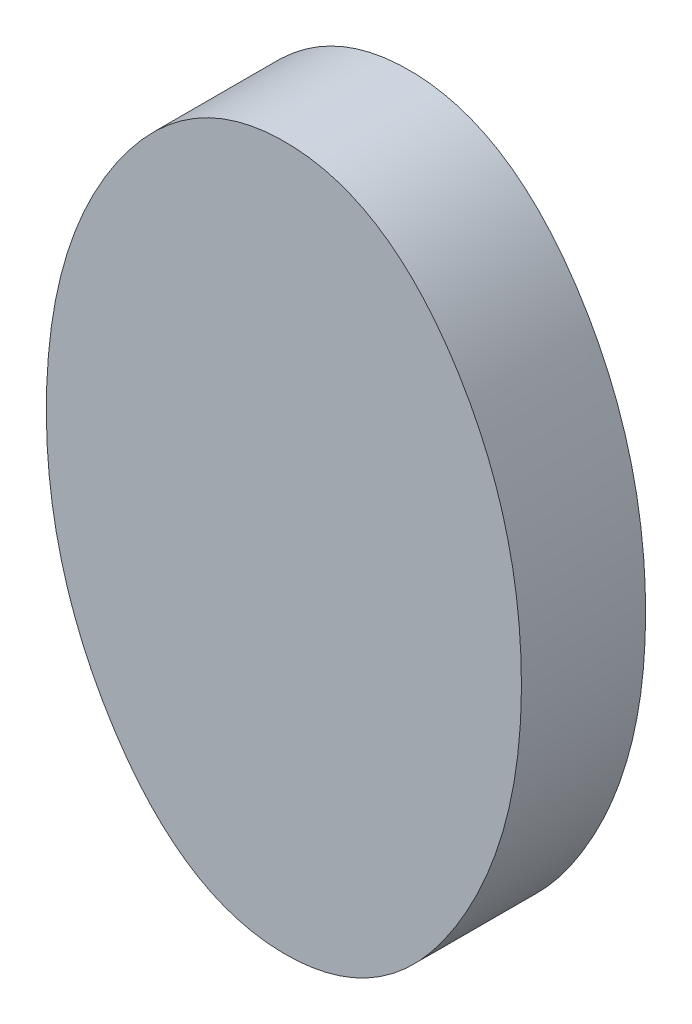
ISO-10303-21;
HEADER;
FILE_DESCRIPTION(('STEP AP214'),'2;1');
FILE_NAME('part.step','',(''),(''),'','','');
FILE_SCHEMA(('AUTOMOTIVE_DESIGN { 1 0 10303 214 1 1 1 1 }'));
ENDSEC;
DATA;
#1=APPLICATION_CONTEXT('core data for automotive mechanical design processes');
#2=APPLICATION_PROTOCOL_DEFINITION('international standard','automotive_design',2000,#1);
#3=PRODUCT_CONTEXT('',#1,'mechanical');
#4=PRODUCT('Part','Part','',(#3));
#5=PRODUCT_RELATED_PRODUCT_CATEGORY('part','',(#4));
#6=PRODUCT_DEFINITION_FORMATION('','',#4);
#7=PRODUCT_DEFINITION_CONTEXT('part definition',#1,'design');
#8=PRODUCT_DEFINITION('design','',#6,#7);
#9=PRODUCT_DEFINITION_SHAPE('','',#8);
#10=(LENGTH_UNIT() NAMED_UNIT(*) SI_UNIT(.MILLI.,.METRE.));
#11=(NAMED_UNIT(*) PLANE_ANGLE_UNIT() SI_UNIT($,.RADIAN.));
#12=(NAMED_UNIT(*) SI_UNIT($,.STERADIAN.) SOLID_ANGLE_UNIT());
#13=UNCERTAINTY_MEASURE_WITH_UNIT(LENGTH_MEASURE(1.E-05),#10,'distance_accuracy_value','');
#14=(GEOMETRIC_REPRESENTATION_CONTEXT(3) GLOBAL_UNCERTAINTY_ASSIGNED_CONTEXT((#13)) GLOBAL_UNIT_ASSIGNED_CONTEXT((#10,
#11,#12)) REPRESENTATION_CONTEXT('',''));
#15=CARTESIAN_POINT('',(0.,0.,0.));
#16=DIRECTION('',(0.,0.,1.));
#17=DIRECTION('',(1.,0.,0.));
#18=AXIS2_PLACEMENT_3D('',#15,#16,#17);
#19=CARTESIAN_POINT('',(-8.95983005625009,-22.7704584365744,333.160489148867));
#20=DIRECTION('',(0.,0.,1.));
#21=DIRECTION('',(1.,0.,0.));
#22=AXIS2_PLACEMENT_3D('',#19,#20,#21);
#23=PLANE('',#22);
#24=CARTESIAN_POINT('',(-10.7301513887414,20.0291224857606,333.160489148867));
#25=CARTESIAN_POINT('',(-10.7301513887414,19.8045130153932,333.160489148867));
#26=CARTESIAN_POINT('',(-10.7846763371274,19.606759323517,333.160489148867));
#27=CARTESIAN_POINT('',(-11.0027748323449,19.2649622818269,333.160489148867));
#28=CARTESIAN_POINT('',(-11.1386799074182,19.1795131107606,333.160489148867));
#29=CARTESIAN_POINT('',(-11.4609451509485,19.1795131107606,333.160489148867));
#30=CARTESIAN_POINT('',(-11.5968506932085,19.2649619748185,333.160489148867));
#31=CARTESIAN_POINT('',(-11.8214596010217,19.6067591091432,333.160489148867));
#32=CARTESIAN_POINT('',(-11.8776126918167,19.8045130153932,333.160489148867));
#33=CARTESIAN_POINT('',(-11.8776119447717,20.2634974857606,333.160489148867));
#34=CARTESIAN_POINT('',(-11.8214602572172,20.4636931467902,333.160489148867));
#35=CARTESIAN_POINT('',(-11.5968502260217,20.7957238575258,333.160489148867));
#36=CARTESIAN_POINT('',(-11.4609451509485,20.8787318607606,333.160489148867));
#37=CARTESIAN_POINT('',(-11.1419349885949,20.8787318607606,333.160489148867));
#38=CARTESIAN_POINT('',(-11.0068442691956,20.7945031485088,333.160489148867));
#39=CARTESIAN_POINT('',(-10.7854896760949,20.4575892826356,333.160489148867));
#40=CARTESIAN_POINT('',(-10.7301513887414,20.2586145778932,333.160489148867));
#41=CARTESIAN_POINT('',(-10.7301513887414,20.0291224857606,333.160489148867));
#42=(BOUNDED_CURVE() B_SPLINE_CURVE(3,(#24,#25,#26,#27,#28,#29,#30,#31,#32,#33,#34,#35,#36,#37,
#38,#39,#40,#41),.UNSPECIFIED.,.T.,.F.) B_SPLINE_CURVE_WITH_KNOTS((4,2,2,2,2,2,2,2,4),(0.,
0.124217334707583,0.248434617574377,0.370167071501347,0.491899204847543,0.618923985709803,
0.745948887307003,0.872974396486983,1.),
.UNSPECIFIED.) CURVE() GEOMETRIC_REPRESENTATION_ITEM() RATIONAL_B_SPLINE_CURVE((1.,1.,1.,1.,1.,
1.,1.,1.,1.,1.,1.,1.,1.,1.,1.,1.,1.,1.)) REPRESENTATION_ITEM(''));
#43=CARTESIAN_POINT('',(-10.7301513887414,20.0291224857606,333.160489148867));
#44=VERTEX_POINT('',#43);
#45=EDGE_CURVE('E11',#44,#44,#42,.T.);
#46=ORIENTED_EDGE('',*,*,#45,.T.);
#47=EDGE_LOOP('',(#46));
#48=FACE_BOUND('',#47,.T.);
#49=ADVANCED_FACE('F43',(#48),#23,.F.);
#50=CARTESIAN_POINT('',(-10.7301513887414,20.0291224857606,332.960489148867));
#51=CARTESIAN_POINT('',(-10.7301513887414,19.8045130153932,332.960489148867));
#52=CARTESIAN_POINT('',(-10.7846763371274,19.606759323517,332.960489148867));
#53=CARTESIAN_POINT('',(-11.0027748323449,19.2649622818269,332.960489148867));
#54=CARTESIAN_POINT('',(-11.1386799074182,19.1795131107606,332.960489148867));
#55=CARTESIAN_POINT('',(-11.4609451509485,19.1795131107606,332.960489148867));
#56=CARTESIAN_POINT('',(-11.5968506932085,19.2649619748185,332.960489148867));
#57=CARTESIAN_POINT('',(-11.8214596010217,19.6067591091432,332.960489148867));
#58=CARTESIAN_POINT('',(-11.8776126918167,19.8045130153932,332.960489148867));
#59=CARTESIAN_POINT('',(-11.8776119447717,20.2634974857606,332.960489148867));
#60=CARTESIAN_POINT('',(-11.8214602572172,20.4636931467902,332.960489148867));
#61=CARTESIAN_POINT('',(-11.5968502260217,20.7957238575258,332.960489148867));
#62=CARTESIAN_POINT('',(-11.4609451509485,20.8787318607606,332.960489148867));
#63=CARTESIAN_POINT('',(-11.1419349885949,20.8787318607606,332.960489148867));
#64=CARTESIAN_POINT('',(-11.0068442691956,20.7945031485088,332.960489148867));
#65=CARTESIAN_POINT('',(-10.7854896760949,20.4575892826356,332.960489148867));
#66=CARTESIAN_POINT('',(-10.7301513887414,20.2586145778932,332.960489148867));
#67=CARTESIAN_POINT('',(-10.7301513887414,20.0291224857606,332.960489148867));
#68=(BOUNDED_CURVE() B_SPLINE_CURVE(3,(#50,#51,#52,#53,#54,#55,#56,#57,#58,#59,#60,#61,#62,#63,
#64,#65,#66,#67),.UNSPECIFIED.,.T.,.F.) B_SPLINE_CURVE_WITH_KNOTS((4,2,2,2,2,2,2,2,4),(0.,
0.124217334707583,0.248434617574377,0.370167071501347,0.491899204847543,0.618923985709803,
0.745948887307003,0.872974396486983,1.),
.UNSPECIFIED.) CURVE() GEOMETRIC_REPRESENTATION_ITEM() RATIONAL_B_SPLINE_CURVE((1.,1.,1.,1.,1.,
1.,1.,1.,1.,1.,1.,1.,1.,1.,1.,1.,1.,1.)) REPRESENTATION_ITEM(''));
#69=DIRECTION('',(0.,0.,1.));
#70=VECTOR('',#69,1.);
#71=SURFACE_OF_LINEAR_EXTRUSION('',#68,#70);
#72=ORIENTED_EDGE('',*,*,#45,.F.);
#73=EDGE_LOOP('',(#72));
#74=FACE_BOUND('',#73,.T.);
#75=CARTESIAN_POINT('',(-10.7301513887414,20.0291224857606,333.460489148867));
#76=CARTESIAN_POINT('',(-10.7301513887414,20.2586145778932,333.460489148867));
#77=CARTESIAN_POINT('',(-10.7854896760949,20.4575892826356,333.460489148867));
#78=CARTESIAN_POINT('',(-11.0068442691956,20.7945031485088,333.460489148867));
#79=CARTESIAN_POINT('',(-11.1419349885949,20.8787318607606,333.460489148867));
#80=CARTESIAN_POINT('',(-11.4609451509485,20.8787318607606,333.460489148867));
#81=CARTESIAN_POINT('',(-11.5968502260217,20.7957238575258,333.460489148867));
#82=CARTESIAN_POINT('',(-11.8214602572172,20.4636931467902,333.460489148867));
#83=CARTESIAN_POINT('',(-11.8776119447717,20.2634974857606,333.460489148867));
#84=CARTESIAN_POINT('',(-11.8776126918167,19.8045130153932,333.460489148867));
#85=CARTESIAN_POINT('',(-11.8214596010217,19.6067591091432,333.460489148867));
#86=CARTESIAN_POINT('',(-11.5968506932085,19.2649619748185,333.460489148867));
#87=CARTESIAN_POINT('',(-11.4609451509485,19.1795131107606,333.460489148867));
#88=CARTESIAN_POINT('',(-11.1386799074182,19.1795131107606,333.460489148867));
#89=CARTESIAN_POINT('',(-11.0027748323449,19.2649622818269,333.460489148867));
#90=CARTESIAN_POINT('',(-10.7846763371274,19.606759323517,333.460489148867));
#91=CARTESIAN_POINT('',(-10.7301513887414,19.8045130153932,333.460489148867));
#92=CARTESIAN_POINT('',(-10.7301513887414,20.0291224857606,333.460489148867));
#93=(BOUNDED_CURVE() B_SPLINE_CURVE(3,(#75,#76,#77,#78,#79,#80,#81,#82,#83,#84,#85,#86,#87,#88,
#89,#90,#91,#92),.UNSPECIFIED.,.T.,.F.) B_SPLINE_CURVE_WITH_KNOTS((4,2,2,2,2,2,2,2,4),(0.,
0.127025603513017,0.254051112692997,0.381076014290197,0.508100795152457,0.629832928498653,
0.751565382425623,0.875782665292417,1.),
.UNSPECIFIED.) CURVE() GEOMETRIC_REPRESENTATION_ITEM() RATIONAL_B_SPLINE_CURVE((1.,1.,1.,1.,1.,
1.,1.,1.,1.,1.,1.,1.,1.,1.,1.,1.,1.,1.)) REPRESENTATION_ITEM(''));
#94=CARTESIAN_POINT('',(-10.7301513887414,20.0291224857606,333.460489148867));
#95=VERTEX_POINT('',#94);
#96=EDGE_CURVE('E48',#95,#95,#93,.T.);
#97=ORIENTED_EDGE('',*,*,#96,.F.);
#98=EDGE_LOOP('',(#97));
#99=FACE_BOUND('',#98,.T.);
#100=ADVANCED_FACE('F45',(#74,#99),#71,.F.);
#101=CARTESIAN_POINT('',(-11.8769271440066,20.0735460924101,333.460489148867));
#102=DIRECTION('',(0.,0.,-1.));
#103=DIRECTION('',(0.,-1.,0.));
#104=AXIS2_PLACEMENT_3D('',#101,#102,#103);
#105=PLANE('',#104);
#106=ORIENTED_EDGE('',*,*,#96,.T.);
#107=EDGE_LOOP('',(#106));
#108=FACE_BOUND('',#107,.T.);
#109=ADVANCED_FACE('F61',(#108),#105,.F.);
#110=CLOSED_SHELL('',(#49,#100,#109));
#111=MANIFOLD_SOLID_BREP('B2',#110);
#112=ADVANCED_BREP_SHAPE_REPRESENTATION('',(#18,#111),#14);
#113=SHAPE_DEFINITION_REPRESENTATION(#9,#112);
ENDSEC;
END-ISO-10303-21;
